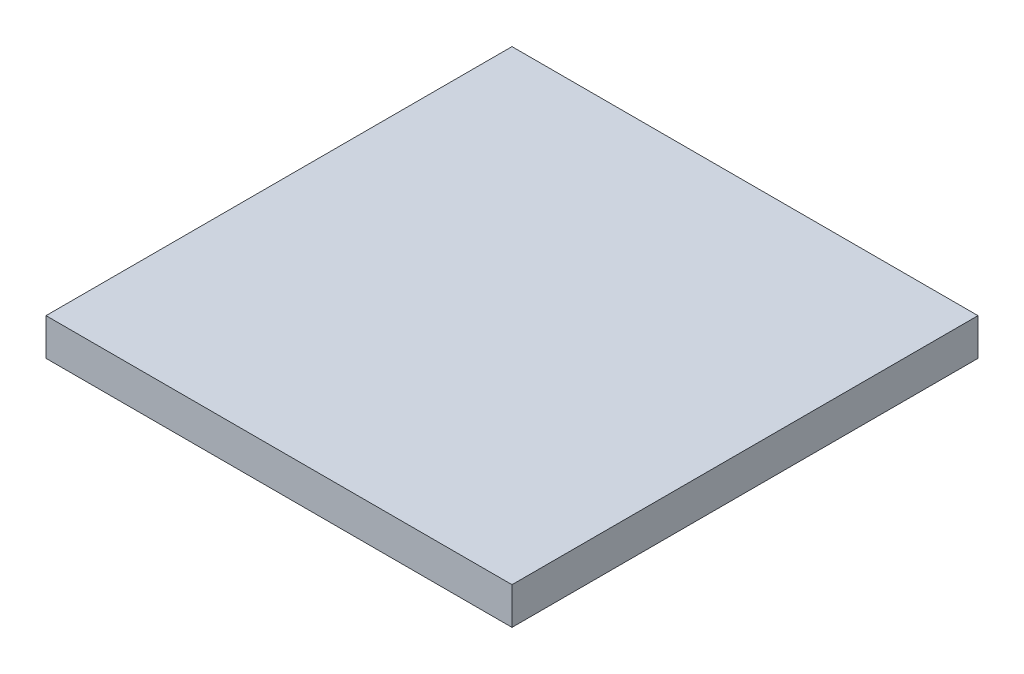
ISO-10303-21;
HEADER;
FILE_DESCRIPTION(('STEP AP214'),'2;1');
FILE_NAME('part.step','',(''),(''),'','','');
FILE_SCHEMA(('AUTOMOTIVE_DESIGN { 1 0 10303 214 1 1 1 1 }'));
ENDSEC;
DATA;
#1=APPLICATION_CONTEXT('core data for automotive mechanical design processes');
#2=APPLICATION_PROTOCOL_DEFINITION('international standard','automotive_design',2000,#1);
#3=PRODUCT_CONTEXT('',#1,'mechanical');
#4=PRODUCT('Part','Part','',(#3));
#5=PRODUCT_RELATED_PRODUCT_CATEGORY('part','',(#4));
#6=PRODUCT_DEFINITION_FORMATION('','',#4);
#7=PRODUCT_DEFINITION_CONTEXT('part definition',#1,'design');
#8=PRODUCT_DEFINITION('design','',#6,#7);
#9=PRODUCT_DEFINITION_SHAPE('','',#8);
#10=(LENGTH_UNIT() NAMED_UNIT(*) SI_UNIT(.MILLI.,.METRE.));
#11=(NAMED_UNIT(*) PLANE_ANGLE_UNIT() SI_UNIT($,.RADIAN.));
#12=(NAMED_UNIT(*) SI_UNIT($,.STERADIAN.) SOLID_ANGLE_UNIT());
#13=UNCERTAINTY_MEASURE_WITH_UNIT(LENGTH_MEASURE(1.E-05),#10,'distance_accuracy_value','');
#14=(GEOMETRIC_REPRESENTATION_CONTEXT(3) GLOBAL_UNCERTAINTY_ASSIGNED_CONTEXT((#13)) GLOBAL_UNIT_ASSIGNED_CONTEXT((#10,
#11,#12)) REPRESENTATION_CONTEXT('',''));
#15=CARTESIAN_POINT('',(0.,0.,0.));
#16=DIRECTION('',(0.,0.,1.));
#17=DIRECTION('',(1.,0.,0.));
#18=AXIS2_PLACEMENT_3D('',#15,#16,#17);
#19=CARTESIAN_POINT('',(13.1143264909847,2.54,-29.3104022191401));
#20=DIRECTION('',(1.,0.,0.));
#21=DIRECTION('',(0.,0.,-1.));
#22=AXIS2_PLACEMENT_3D('',#19,#20,#21);
#23=PLANE('',#22);
#24=DIRECTION('',(0.,0.,1.));
#25=VECTOR('',#24,1.);
#26=CARTESIAN_POINT('',(13.1143264909847,0.,-29.3104022191401));
#27=LINE('',#26,#25);
#28=CARTESIAN_POINT('',(13.1143264909847,0.,-29.3104022191401));
#29=VERTEX_POINT('',#28);
#30=CARTESIAN_POINT('',(13.1143264909847,0.,2.66819778085992));
#31=VERTEX_POINT('',#30);
#32=EDGE_CURVE('E99',#29,#31,#27,.T.);
#33=ORIENTED_EDGE('',*,*,#32,.T.);
#34=DIRECTION('',(0.,-1.,0.));
#35=VECTOR('',#34,1.);
#36=CARTESIAN_POINT('',(13.1143264909847,2.54,2.66819778085992));
#37=LINE('',#36,#35);
#38=CARTESIAN_POINT('',(13.1143264909847,2.54,2.66819778085992));
#39=VERTEX_POINT('',#38);
#40=EDGE_CURVE('E11',#39,#31,#37,.T.);
#41=ORIENTED_EDGE('',*,*,#40,.F.);
#42=DIRECTION('',(0.,0.,1.));
#43=VECTOR('',#42,1.);
#44=CARTESIAN_POINT('',(13.1143264909847,2.54,-29.3104022191401));
#45=LINE('',#44,#43);
#46=CARTESIAN_POINT('',(13.1143264909847,2.54,-29.3104022191401));
#47=VERTEX_POINT('',#46);
#48=EDGE_CURVE('E87',#47,#39,#45,.T.);
#49=ORIENTED_EDGE('',*,*,#48,.F.);
#50=DIRECTION('',(0.,-1.,0.));
#51=VECTOR('',#50,1.);
#52=CARTESIAN_POINT('',(13.1143264909847,2.54,-29.3104022191401));
#53=LINE('',#52,#51);
#54=EDGE_CURVE('E95',#47,#29,#53,.T.);
#55=ORIENTED_EDGE('',*,*,#54,.T.);
#56=EDGE_LOOP('',(#33,#41,#49,#55));
#57=FACE_BOUND('',#56,.T.);
#58=ADVANCED_FACE('F36',(#57),#23,.F.);
#59=CARTESIAN_POINT('',(13.1143264909847,2.54,2.66819778085992));
#60=DIRECTION('',(0.,0.,-1.));
#61=DIRECTION('',(-1.,0.,0.));
#62=AXIS2_PLACEMENT_3D('',#59,#60,#61);
#63=PLANE('',#62);
#64=DIRECTION('',(1.,0.,0.));
#65=VECTOR('',#64,1.);
#66=CARTESIAN_POINT('',(13.1143264909847,0.,2.66819778085992));
#67=LINE('',#66,#65);
#68=CARTESIAN_POINT('',(45.0929264909847,0.,2.66819778085992));
#69=VERTEX_POINT('',#68);
#70=EDGE_CURVE('E91',#31,#69,#67,.T.);
#71=ORIENTED_EDGE('',*,*,#70,.T.);
#72=DIRECTION('',(0.,-1.,0.));
#73=VECTOR('',#72,1.);
#74=CARTESIAN_POINT('',(45.0929264909847,2.54,2.66819778085992));
#75=LINE('',#74,#73);
#76=CARTESIAN_POINT('',(45.0929264909847,2.54,2.66819778085992));
#77=VERTEX_POINT('',#76);
#78=EDGE_CURVE('E44',#77,#69,#75,.T.);
#79=ORIENTED_EDGE('',*,*,#78,.F.);
#80=DIRECTION('',(1.,0.,0.));
#81=VECTOR('',#80,1.);
#82=CARTESIAN_POINT('',(13.1143264909847,2.54,2.66819778085992));
#83=LINE('',#82,#81);
#84=EDGE_CURVE('E82',#39,#77,#83,.T.);
#85=ORIENTED_EDGE('',*,*,#84,.F.);
#86=ORIENTED_EDGE('',*,*,#40,.T.);
#87=EDGE_LOOP('',(#71,#79,#85,#86));
#88=FACE_BOUND('',#87,.T.);
#89=ADVANCED_FACE('F90',(#88),#63,.F.);
#90=CARTESIAN_POINT('',(45.0929264909847,2.54,-29.3104022191401));
#91=DIRECTION('',(-1.,0.,0.));
#92=DIRECTION('',(0.,0.,1.));
#93=AXIS2_PLACEMENT_3D('',#90,#91,#92);
#94=PLANE('',#93);
#95=DIRECTION('',(0.,0.,-1.));
#96=VECTOR('',#95,1.);
#97=CARTESIAN_POINT('',(45.0929264909847,0.,-29.3104022191401));
#98=LINE('',#97,#96);
#99=CARTESIAN_POINT('',(45.0929264909847,0.,-29.3104022191401));
#100=VERTEX_POINT('',#99);
#101=EDGE_CURVE('E69',#69,#100,#98,.T.);
#102=ORIENTED_EDGE('',*,*,#101,.T.);
#103=DIRECTION('',(0.,-1.,0.));
#104=VECTOR('',#103,1.);
#105=CARTESIAN_POINT('',(45.0929264909847,2.54,-29.3104022191401));
#106=LINE('',#105,#104);
#107=CARTESIAN_POINT('',(45.0929264909847,2.54,-29.3104022191401));
#108=VERTEX_POINT('',#107);
#109=EDGE_CURVE('E92',#108,#100,#106,.T.);
#110=ORIENTED_EDGE('',*,*,#109,.F.);
#111=DIRECTION('',(0.,0.,-1.));
#112=VECTOR('',#111,1.);
#113=CARTESIAN_POINT('',(45.0929264909847,2.54,-29.3104022191401));
#114=LINE('',#113,#112);
#115=EDGE_CURVE('E85',#77,#108,#114,.T.);
#116=ORIENTED_EDGE('',*,*,#115,.F.);
#117=ORIENTED_EDGE('',*,*,#78,.T.);
#118=EDGE_LOOP('',(#102,#110,#116,#117));
#119=FACE_BOUND('',#118,.T.);
#120=ADVANCED_FACE('F93',(#119),#94,.F.);
#121=CARTESIAN_POINT('',(13.1143264909847,2.54,-29.3104022191401));
#122=DIRECTION('',(0.,0.,1.));
#123=DIRECTION('',(1.,0.,0.));
#124=AXIS2_PLACEMENT_3D('',#121,#122,#123);
#125=PLANE('',#124);
#126=DIRECTION('',(-1.,0.,0.));
#127=VECTOR('',#126,1.);
#128=CARTESIAN_POINT('',(13.1143264909847,0.,-29.3104022191401));
#129=LINE('',#128,#127);
#130=EDGE_CURVE('E75',#100,#29,#129,.T.);
#131=ORIENTED_EDGE('',*,*,#130,.T.);
#132=ORIENTED_EDGE('',*,*,#54,.F.);
#133=DIRECTION('',(-1.,0.,0.));
#134=VECTOR('',#133,1.);
#135=CARTESIAN_POINT('',(13.1143264909847,2.54,-29.3104022191401));
#136=LINE('',#135,#134);
#137=EDGE_CURVE('E52',#108,#47,#136,.T.);
#138=ORIENTED_EDGE('',*,*,#137,.F.);
#139=ORIENTED_EDGE('',*,*,#109,.T.);
#140=EDGE_LOOP('',(#131,#132,#138,#139));
#141=FACE_BOUND('',#140,.T.);
#142=ADVANCED_FACE('F106',(#141),#125,.F.);
#143=CARTESIAN_POINT('',(0.,2.54,0.));
#144=DIRECTION('',(0.,1.,0.));
#145=DIRECTION('',(0.,0.,1.));
#146=AXIS2_PLACEMENT_3D('',#143,#144,#145);
#147=PLANE('',#146);
#148=ORIENTED_EDGE('',*,*,#48,.T.);
#149=ORIENTED_EDGE('',*,*,#84,.T.);
#150=ORIENTED_EDGE('',*,*,#115,.T.);
#151=ORIENTED_EDGE('',*,*,#137,.T.);
#152=EDGE_LOOP('',(#148,#149,#150,#151));
#153=FACE_BOUND('',#152,.T.);
#154=ADVANCED_FACE('F83',(#153),#147,.T.);
#155=CARTESIAN_POINT('',(0.,0.,0.));
#156=DIRECTION('',(0.,1.,0.));
#157=DIRECTION('',(0.,0.,1.));
#158=AXIS2_PLACEMENT_3D('',#155,#156,#157);
#159=PLANE('',#158);
#160=ORIENTED_EDGE('',*,*,#32,.F.);
#161=ORIENTED_EDGE('',*,*,#130,.F.);
#162=ORIENTED_EDGE('',*,*,#101,.F.);
#163=ORIENTED_EDGE('',*,*,#70,.F.);
#164=EDGE_LOOP('',(#160,#161,#162,#163));
#165=FACE_BOUND('',#164,.T.);
#166=ADVANCED_FACE('F109',(#165),#159,.F.);
#167=CLOSED_SHELL('',(#58,#89,#120,#142,#154,#166));
#168=MANIFOLD_SOLID_BREP('B2',#167);
#169=ADVANCED_BREP_SHAPE_REPRESENTATION('',(#18,#168),#14);
#170=SHAPE_DEFINITION_REPRESENTATION(#9,#169);
ENDSEC;
END-ISO-10303-21;
